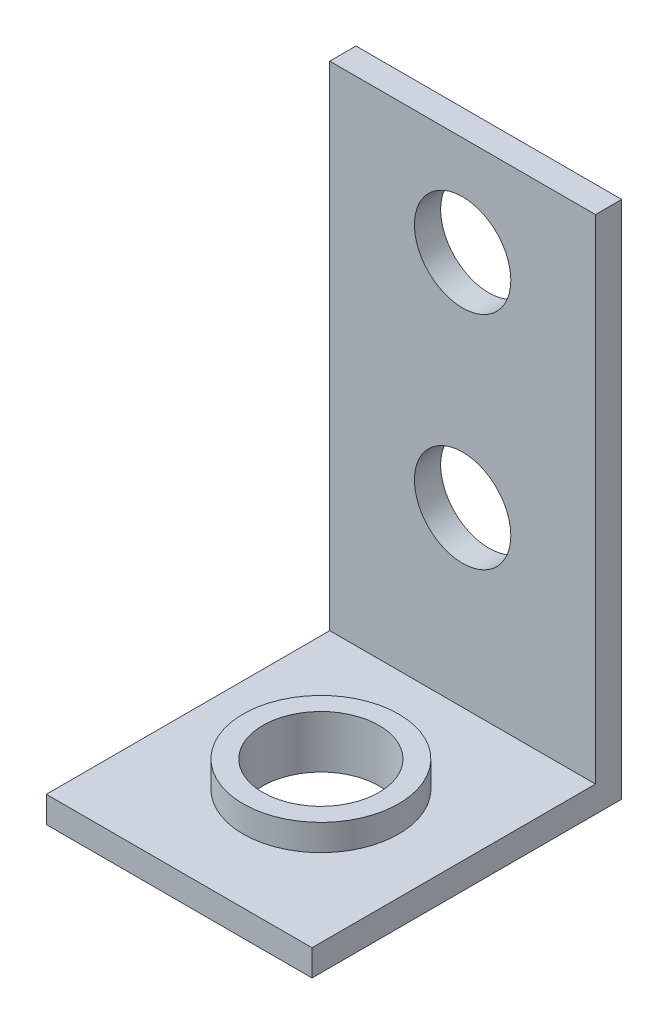
ISO-10303-21;
HEADER;
FILE_DESCRIPTION(('STEP AP214'),'2;1');
FILE_NAME('part.step','',(''),(''),'','','');
FILE_SCHEMA(('AUTOMOTIVE_DESIGN { 1 0 10303 214 1 1 1 1 }'));
ENDSEC;
DATA;
#1=APPLICATION_CONTEXT('core data for automotive mechanical design processes');
#2=APPLICATION_PROTOCOL_DEFINITION('international standard','automotive_design',2000,#1);
#3=PRODUCT_CONTEXT('',#1,'mechanical');
#4=PRODUCT('Part','Part','',(#3));
#5=PRODUCT_RELATED_PRODUCT_CATEGORY('part','',(#4));
#6=PRODUCT_DEFINITION_FORMATION('','',#4);
#7=PRODUCT_DEFINITION_CONTEXT('part definition',#1,'design');
#8=PRODUCT_DEFINITION('design','',#6,#7);
#9=PRODUCT_DEFINITION_SHAPE('','',#8);
#10=(LENGTH_UNIT() NAMED_UNIT(*) SI_UNIT(.MILLI.,.METRE.));
#11=(NAMED_UNIT(*) PLANE_ANGLE_UNIT() SI_UNIT($,.RADIAN.));
#12=(NAMED_UNIT(*) SI_UNIT($,.STERADIAN.) SOLID_ANGLE_UNIT());
#13=UNCERTAINTY_MEASURE_WITH_UNIT(LENGTH_MEASURE(1.E-05),#10,'distance_accuracy_value','');
#14=(GEOMETRIC_REPRESENTATION_CONTEXT(3) GLOBAL_UNCERTAINTY_ASSIGNED_CONTEXT((#13)) GLOBAL_UNIT_ASSIGNED_CONTEXT((#10,
#11,#12)) REPRESENTATION_CONTEXT('',''));
#15=CARTESIAN_POINT('',(0.,0.,0.));
#16=DIRECTION('',(0.,0.,1.));
#17=DIRECTION('',(1.,0.,0.));
#18=AXIS2_PLACEMENT_3D('',#15,#16,#17);
#19=CARTESIAN_POINT('',(0.,0.9398,0.));
#20=DIRECTION('',(0.,-1.,0.));
#21=DIRECTION('',(0.,0.,-1.));
#22=AXIS2_PLACEMENT_3D('',#19,#20,#21);
#23=PLANE('',#22);
#24=DIRECTION('',(1.,0.,0.));
#25=VECTOR('',#24,1.);
#26=CARTESIAN_POINT('',(0.,0.9398,-10.16));
#27=LINE('',#26,#25);
#28=CARTESIAN_POINT('',(0.,0.9398,-10.16));
#29=VERTEX_POINT('',#28);
#30=CARTESIAN_POINT('',(9.525,0.9398,-10.16));
#31=VERTEX_POINT('',#30);
#32=EDGE_CURVE('E47',#29,#31,#27,.T.);
#33=ORIENTED_EDGE('',*,*,#32,.F.);
#34=DIRECTION('',(0.,0.,1.));
#35=VECTOR('',#34,1.);
#36=CARTESIAN_POINT('',(0.,0.9398,0.));
#37=LINE('',#36,#35);
#38=CARTESIAN_POINT('',(0.,0.9398,0.));
#39=VERTEX_POINT('',#38);
#40=EDGE_CURVE('E84',#29,#39,#37,.T.);
#41=ORIENTED_EDGE('',*,*,#40,.T.);
#42=DIRECTION('',(1.,0.,0.));
#43=VECTOR('',#42,1.);
#44=CARTESIAN_POINT('',(0.,0.9398,0.));
#45=LINE('',#44,#43);
#46=CARTESIAN_POINT('',(9.525,0.9398,0.));
#47=VERTEX_POINT('',#46);
#48=EDGE_CURVE('E53',#39,#47,#45,.T.);
#49=ORIENTED_EDGE('',*,*,#48,.T.);
#50=DIRECTION('',(0.,0.,-1.));
#51=VECTOR('',#50,1.);
#52=CARTESIAN_POINT('',(9.525,0.9398,0.));
#53=LINE('',#52,#51);
#54=EDGE_CURVE('E95',#47,#31,#53,.T.);
#55=ORIENTED_EDGE('',*,*,#54,.T.);
#56=EDGE_LOOP('',(#33,#41,#49,#55));
#57=FACE_BOUND('',#56,.T.);
#58=CARTESIAN_POINT('',(4.7625,0.9398,-5.08));
#59=DIRECTION('',(0.,-1.,0.));
#60=DIRECTION('',(0.,0.,-1.));
#61=AXIS2_PLACEMENT_3D('',#58,#59,#60);
#62=CIRCLE('',#61,2.78765);
#63=CARTESIAN_POINT('',(4.7625,0.9398,-7.86765));
#64=VERTEX_POINT('',#63);
#65=EDGE_CURVE('E11',#64,#64,#62,.F.);
#66=ORIENTED_EDGE('',*,*,#65,.F.);
#67=EDGE_LOOP('',(#66));
#68=FACE_BOUND('',#67,.T.);
#69=ADVANCED_FACE('F32',(#57,#68),#23,.F.);
#70=CARTESIAN_POINT('',(0.,0.9398,0.));
#71=DIRECTION('',(1.,0.,0.));
#72=DIRECTION('',(0.,0.,-1.));
#73=AXIS2_PLACEMENT_3D('',#70,#71,#72);
#74=PLANE('',#73);
#75=DIRECTION('',(0.,0.,1.));
#76=VECTOR('',#75,1.);
#77=CARTESIAN_POINT('',(0.,0.,0.));
#78=LINE('',#77,#76);
#79=CARTESIAN_POINT('',(0.,0.,-11.0998));
#80=VERTEX_POINT('',#79);
#81=CARTESIAN_POINT('',(0.,0.,0.));
#82=VERTEX_POINT('',#81);
#83=EDGE_CURVE('E91',#80,#82,#78,.T.);
#84=ORIENTED_EDGE('',*,*,#83,.T.);
#85=DIRECTION('',(0.,-1.,0.));
#86=VECTOR('',#85,1.);
#87=CARTESIAN_POINT('',(0.,0.9398,0.));
#88=LINE('',#87,#86);
#89=EDGE_CURVE('E40',#39,#82,#88,.T.);
#90=ORIENTED_EDGE('',*,*,#89,.F.);
#91=ORIENTED_EDGE('',*,*,#40,.F.);
#92=DIRECTION('',(0.,-1.,0.));
#93=VECTOR('',#92,1.);
#94=CARTESIAN_POINT('',(0.,18.6182,-10.16));
#95=LINE('',#94,#93);
#96=CARTESIAN_POINT('',(0.,18.6182,-10.16));
#97=VERTEX_POINT('',#96);
#98=EDGE_CURVE('E100',#97,#29,#95,.T.);
#99=ORIENTED_EDGE('',*,*,#98,.F.);
#100=DIRECTION('',(0.,0.,1.));
#101=VECTOR('',#100,1.);
#102=CARTESIAN_POINT('',(0.,18.6182,-11.0998));
#103=LINE('',#102,#101);
#104=CARTESIAN_POINT('',(0.,18.6182,-11.0998));
#105=VERTEX_POINT('',#104);
#106=EDGE_CURVE('E94',#105,#97,#103,.T.);
#107=ORIENTED_EDGE('',*,*,#106,.F.);
#108=DIRECTION('',(0.,-1.,0.));
#109=VECTOR('',#108,1.);
#110=CARTESIAN_POINT('',(0.,0.9398,-11.0998));
#111=LINE('',#110,#109);
#112=EDGE_CURVE('E77',#105,#80,#111,.T.);
#113=ORIENTED_EDGE('',*,*,#112,.T.);
#114=EDGE_LOOP('',(#84,#90,#91,#99,#107,#113));
#115=FACE_BOUND('',#114,.T.);
#116=ADVANCED_FACE('F34',(#115),#74,.F.);
#117=CARTESIAN_POINT('',(0.,0.9398,0.));
#118=DIRECTION('',(0.,0.,-1.));
#119=DIRECTION('',(-1.,0.,0.));
#120=AXIS2_PLACEMENT_3D('',#117,#118,#119);
#121=PLANE('',#120);
#122=DIRECTION('',(1.,0.,0.));
#123=VECTOR('',#122,1.);
#124=CARTESIAN_POINT('',(0.,0.,0.));
#125=LINE('',#124,#123);
#126=CARTESIAN_POINT('',(9.525,0.,0.));
#127=VERTEX_POINT('',#126);
#128=EDGE_CURVE('E98',#82,#127,#125,.T.);
#129=ORIENTED_EDGE('',*,*,#128,.T.);
#130=DIRECTION('',(0.,-1.,0.));
#131=VECTOR('',#130,1.);
#132=CARTESIAN_POINT('',(9.525,0.9398,0.));
#133=LINE('',#132,#131);
#134=EDGE_CURVE('E112',#47,#127,#133,.T.);
#135=ORIENTED_EDGE('',*,*,#134,.F.);
#136=ORIENTED_EDGE('',*,*,#48,.F.);
#137=ORIENTED_EDGE('',*,*,#89,.T.);
#138=EDGE_LOOP('',(#129,#135,#136,#137));
#139=FACE_BOUND('',#138,.T.);
#140=ADVANCED_FACE('F193',(#139),#121,.F.);
#141=CARTESIAN_POINT('',(9.525,0.9398,0.));
#142=DIRECTION('',(-1.,0.,0.));
#143=DIRECTION('',(0.,0.,1.));
#144=AXIS2_PLACEMENT_3D('',#141,#142,#143);
#145=PLANE('',#144);
#146=DIRECTION('',(0.,0.,-1.));
#147=VECTOR('',#146,1.);
#148=CARTESIAN_POINT('',(9.525,0.,0.));
#149=LINE('',#148,#147);
#150=CARTESIAN_POINT('',(9.525,0.,-11.0998));
#151=VERTEX_POINT('',#150);
#152=EDGE_CURVE('E85',#127,#151,#149,.T.);
#153=ORIENTED_EDGE('',*,*,#152,.T.);
#154=DIRECTION('',(0.,-1.,0.));
#155=VECTOR('',#154,1.);
#156=CARTESIAN_POINT('',(9.525,0.9398,-11.0998));
#157=LINE('',#156,#155);
#158=CARTESIAN_POINT('',(9.525,18.6182,-11.0998));
#159=VERTEX_POINT('',#158);
#160=EDGE_CURVE('E80',#159,#151,#157,.T.);
#161=ORIENTED_EDGE('',*,*,#160,.F.);
#162=DIRECTION('',(0.,0.,-1.));
#163=VECTOR('',#162,1.);
#164=CARTESIAN_POINT('',(9.525,18.6182,-11.0998));
#165=LINE('',#164,#163);
#166=CARTESIAN_POINT('',(9.525,18.6182,-10.16));
#167=VERTEX_POINT('',#166);
#168=EDGE_CURVE('E138',#167,#159,#165,.T.);
#169=ORIENTED_EDGE('',*,*,#168,.F.);
#170=DIRECTION('',(0.,-1.,0.));
#171=VECTOR('',#170,1.);
#172=CARTESIAN_POINT('',(9.525,18.6182,-10.16));
#173=LINE('',#172,#171);
#174=EDGE_CURVE('E104',#167,#31,#173,.T.);
#175=ORIENTED_EDGE('',*,*,#174,.T.);
#176=ORIENTED_EDGE('',*,*,#54,.F.);
#177=ORIENTED_EDGE('',*,*,#134,.T.);
#178=EDGE_LOOP('',(#153,#161,#169,#175,#176,#177));
#179=FACE_BOUND('',#178,.T.);
#180=ADVANCED_FACE('F136',(#179),#145,.F.);
#181=CARTESIAN_POINT('',(0.,0.9398,-11.0998));
#182=DIRECTION('',(0.,0.,1.));
#183=DIRECTION('',(1.,0.,0.));
#184=AXIS2_PLACEMENT_3D('',#181,#182,#183);
#185=PLANE('',#184);
#186=CARTESIAN_POINT('',(4.7625,7.1374,-11.0998));
#187=DIRECTION('',(0.,0.,1.));
#188=DIRECTION('',(1.,0.,0.));
#189=AXIS2_PLACEMENT_3D('',#186,#187,#188);
#190=CIRCLE('',#189,1.7272);
#191=CARTESIAN_POINT('',(6.4897,7.1374,-11.0998));
#192=VERTEX_POINT('',#191);
#193=EDGE_CURVE('E154',#192,#192,#190,.T.);
#194=ORIENTED_EDGE('',*,*,#193,.T.);
#195=EDGE_LOOP('',(#194));
#196=FACE_BOUND('',#195,.T.);
#197=CARTESIAN_POINT('',(4.7625,15.0622,-11.0998));
#198=DIRECTION('',(0.,0.,1.));
#199=DIRECTION('',(1.,0.,0.));
#200=AXIS2_PLACEMENT_3D('',#197,#198,#199);
#201=CIRCLE('',#200,1.7272);
#202=CARTESIAN_POINT('',(6.4897,15.0622,-11.0998));
#203=VERTEX_POINT('',#202);
#204=EDGE_CURVE('E135',#203,#203,#201,.T.);
#205=ORIENTED_EDGE('',*,*,#204,.T.);
#206=EDGE_LOOP('',(#205));
#207=FACE_BOUND('',#206,.T.);
#208=DIRECTION('',(-1.,0.,0.));
#209=VECTOR('',#208,1.);
#210=CARTESIAN_POINT('',(0.,0.,-11.0998));
#211=LINE('',#210,#209);
#212=EDGE_CURVE('E73',#151,#80,#211,.T.);
#213=ORIENTED_EDGE('',*,*,#212,.T.);
#214=ORIENTED_EDGE('',*,*,#112,.F.);
#215=DIRECTION('',(-1.,0.,0.));
#216=VECTOR('',#215,1.);
#217=CARTESIAN_POINT('',(0.,18.6182,-11.0998));
#218=LINE('',#217,#216);
#219=EDGE_CURVE('E139',#159,#105,#218,.T.);
#220=ORIENTED_EDGE('',*,*,#219,.F.);
#221=ORIENTED_EDGE('',*,*,#160,.T.);
#222=EDGE_LOOP('',(#213,#214,#220,#221));
#223=FACE_BOUND('',#222,.T.);
#224=ADVANCED_FACE('F75',(#196,#207,#223),#185,.F.);
#225=CARTESIAN_POINT('',(0.,0.,0.));
#226=DIRECTION('',(0.,-1.,0.));
#227=DIRECTION('',(0.,0.,-1.));
#228=AXIS2_PLACEMENT_3D('',#225,#226,#227);
#229=PLANE('',#228);
#230=CARTESIAN_POINT('',(4.7625,0.,-5.08));
#231=DIRECTION('',(0.,1.,0.));
#232=DIRECTION('',(0.,0.,1.));
#233=AXIS2_PLACEMENT_3D('',#230,#231,#232);
#234=CIRCLE('',#233,2.0828);
#235=CARTESIAN_POINT('',(4.7625,0.,-2.9972));
#236=VERTEX_POINT('',#235);
#237=EDGE_CURVE('E160',#236,#236,#234,.T.);
#238=ORIENTED_EDGE('',*,*,#237,.T.);
#239=EDGE_LOOP('',(#238));
#240=FACE_BOUND('',#239,.T.);
#241=ORIENTED_EDGE('',*,*,#83,.F.);
#242=ORIENTED_EDGE('',*,*,#212,.F.);
#243=ORIENTED_EDGE('',*,*,#152,.F.);
#244=ORIENTED_EDGE('',*,*,#128,.F.);
#245=EDGE_LOOP('',(#241,#242,#243,#244));
#246=FACE_BOUND('',#245,.T.);
#247=ADVANCED_FACE('F97',(#240,#246),#229,.T.);
#248=CARTESIAN_POINT('',(0.,18.6182,-10.16));
#249=DIRECTION('',(0.,0.,-1.));
#250=DIRECTION('',(-1.,0.,0.));
#251=AXIS2_PLACEMENT_3D('',#248,#249,#250);
#252=PLANE('',#251);
#253=CARTESIAN_POINT('',(4.7625,7.1374,-10.16));
#254=DIRECTION('',(0.,0.,1.));
#255=DIRECTION('',(1.,0.,0.));
#256=AXIS2_PLACEMENT_3D('',#253,#254,#255);
#257=CIRCLE('',#256,1.7272);
#258=CARTESIAN_POINT('',(6.4897,7.1374,-10.16));
#259=VERTEX_POINT('',#258);
#260=EDGE_CURVE('E157',#259,#259,#257,.T.);
#261=ORIENTED_EDGE('',*,*,#260,.F.);
#262=EDGE_LOOP('',(#261));
#263=FACE_BOUND('',#262,.T.);
#264=CARTESIAN_POINT('',(4.7625,15.0622,-10.16));
#265=DIRECTION('',(0.,0.,1.));
#266=DIRECTION('',(1.,0.,0.));
#267=AXIS2_PLACEMENT_3D('',#264,#265,#266);
#268=CIRCLE('',#267,1.7272);
#269=CARTESIAN_POINT('',(6.4897,15.0622,-10.16));
#270=VERTEX_POINT('',#269);
#271=EDGE_CURVE('E151',#270,#270,#268,.T.);
#272=ORIENTED_EDGE('',*,*,#271,.F.);
#273=EDGE_LOOP('',(#272));
#274=FACE_BOUND('',#273,.T.);
#275=ORIENTED_EDGE('',*,*,#32,.T.);
#276=ORIENTED_EDGE('',*,*,#174,.F.);
#277=DIRECTION('',(1.,0.,0.));
#278=VECTOR('',#277,1.);
#279=CARTESIAN_POINT('',(0.,18.6182,-10.16));
#280=LINE('',#279,#278);
#281=EDGE_CURVE('E145',#97,#167,#280,.T.);
#282=ORIENTED_EDGE('',*,*,#281,.F.);
#283=ORIENTED_EDGE('',*,*,#98,.T.);
#284=EDGE_LOOP('',(#275,#276,#282,#283));
#285=FACE_BOUND('',#284,.T.);
#286=ADVANCED_FACE('F131',(#263,#274,#285),#252,.F.);
#287=CARTESIAN_POINT('',(0.,18.6182,0.));
#288=DIRECTION('',(0.,1.,0.));
#289=DIRECTION('',(0.,0.,1.));
#290=AXIS2_PLACEMENT_3D('',#287,#288,#289);
#291=PLANE('',#290);
#292=ORIENTED_EDGE('',*,*,#106,.T.);
#293=ORIENTED_EDGE('',*,*,#281,.T.);
#294=ORIENTED_EDGE('',*,*,#168,.T.);
#295=ORIENTED_EDGE('',*,*,#219,.T.);
#296=EDGE_LOOP('',(#292,#293,#294,#295));
#297=FACE_BOUND('',#296,.T.);
#298=ADVANCED_FACE('F210',(#297),#291,.T.);
#299=CARTESIAN_POINT('',(4.7625,15.0622,-11.0998));
#300=DIRECTION('',(0.,0.,1.));
#301=DIRECTION('',(1.,0.,0.));
#302=AXIS2_PLACEMENT_3D('',#299,#300,#301);
#303=CYLINDRICAL_SURFACE('',#302,1.7272);
#304=ORIENTED_EDGE('',*,*,#204,.F.);
#305=EDGE_LOOP('',(#304));
#306=FACE_BOUND('',#305,.T.);
#307=ORIENTED_EDGE('',*,*,#271,.T.);
#308=EDGE_LOOP('',(#307));
#309=FACE_BOUND('',#308,.T.);
#310=ADVANCED_FACE('F215',(#306,#309),#303,.F.);
#311=CARTESIAN_POINT('',(4.7625,7.1374,-11.0998));
#312=DIRECTION('',(0.,0.,1.));
#313=DIRECTION('',(1.,0.,0.));
#314=AXIS2_PLACEMENT_3D('',#311,#312,#313);
#315=CYLINDRICAL_SURFACE('',#314,1.7272);
#316=ORIENTED_EDGE('',*,*,#193,.F.);
#317=EDGE_LOOP('',(#316));
#318=FACE_BOUND('',#317,.T.);
#319=ORIENTED_EDGE('',*,*,#260,.T.);
#320=EDGE_LOOP('',(#319));
#321=FACE_BOUND('',#320,.T.);
#322=ADVANCED_FACE('F185',(#318,#321),#315,.F.);
#323=CARTESIAN_POINT('',(4.7625,0.,-5.08));
#324=DIRECTION('',(0.,1.,0.));
#325=DIRECTION('',(0.,0.,1.));
#326=AXIS2_PLACEMENT_3D('',#323,#324,#325);
#327=CYLINDRICAL_SURFACE('',#326,2.0828);
#328=ORIENTED_EDGE('',*,*,#237,.F.);
#329=EDGE_LOOP('',(#328));
#330=FACE_BOUND('',#329,.T.);
#331=CARTESIAN_POINT('',(4.7625,1.8796,-5.08));
#332=DIRECTION('',(0.,1.,0.));
#333=DIRECTION('',(0.,0.,1.));
#334=AXIS2_PLACEMENT_3D('',#331,#332,#333);
#335=CIRCLE('',#334,2.0828);
#336=CARTESIAN_POINT('',(4.7625,1.8796,-2.9972));
#337=VERTEX_POINT('',#336);
#338=EDGE_CURVE('E168',#337,#337,#335,.T.);
#339=ORIENTED_EDGE('',*,*,#338,.T.);
#340=EDGE_LOOP('',(#339));
#341=FACE_BOUND('',#340,.T.);
#342=ADVANCED_FACE('F172',(#330,#341),#327,.F.);
#343=CARTESIAN_POINT('',(4.7625,1.8796,-5.08));
#344=DIRECTION('',(0.,1.,0.));
#345=DIRECTION('',(0.,0.,1.));
#346=AXIS2_PLACEMENT_3D('',#343,#344,#345);
#347=PLANE('',#346);
#348=CARTESIAN_POINT('',(4.7625,1.8796,-5.08));
#349=DIRECTION('',(0.,1.,0.));
#350=DIRECTION('',(0.,0.,1.));
#351=AXIS2_PLACEMENT_3D('',#348,#349,#350);
#352=CIRCLE('',#351,2.78765);
#353=CARTESIAN_POINT('',(4.7625,1.8796,-2.29235));
#354=VERTEX_POINT('',#353);
#355=EDGE_CURVE('E165',#354,#354,#352,.T.);
#356=ORIENTED_EDGE('',*,*,#355,.T.);
#357=EDGE_LOOP('',(#356));
#358=FACE_BOUND('',#357,.T.);
#359=ORIENTED_EDGE('',*,*,#338,.F.);
#360=EDGE_LOOP('',(#359));
#361=FACE_BOUND('',#360,.T.);
#362=ADVANCED_FACE('F174',(#358,#361),#347,.T.);
#363=CARTESIAN_POINT('',(4.7625,1.8796,-5.08));
#364=DIRECTION('',(0.,-1.,0.));
#365=DIRECTION('',(0.,0.,-1.));
#366=AXIS2_PLACEMENT_3D('',#363,#364,#365);
#367=CYLINDRICAL_SURFACE('',#366,2.78765);
#368=ORIENTED_EDGE('',*,*,#355,.F.);
#369=EDGE_LOOP('',(#368));
#370=FACE_BOUND('',#369,.T.);
#371=ORIENTED_EDGE('',*,*,#65,.T.);
#372=EDGE_LOOP('',(#371));
#373=FACE_BOUND('',#372,.T.);
#374=ADVANCED_FACE('F176',(#370,#373),#367,.T.);
#375=CLOSED_SHELL('',(#69,#116,#140,#180,#224,#247,#286,#298,#310,#322,#342,#362,#374));
#376=MANIFOLD_SOLID_BREP('B2',#375);
#377=ADVANCED_BREP_SHAPE_REPRESENTATION('',(#18,#376),#14);
#378=SHAPE_DEFINITION_REPRESENTATION(#9,#377);
ENDSEC;
END-ISO-10303-21;
